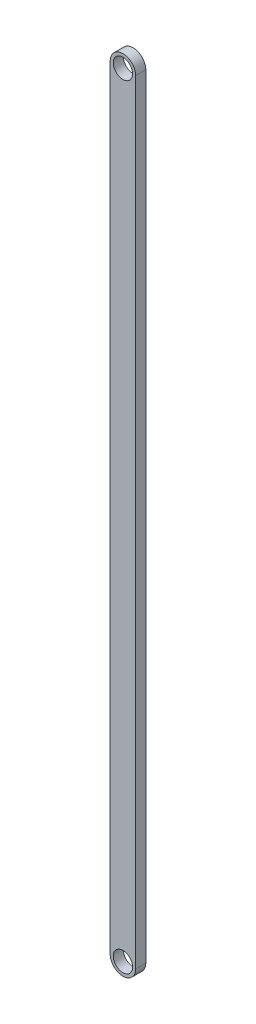
ISO-10303-21;
HEADER;
FILE_DESCRIPTION(('STEP AP214'),'2;1');
FILE_NAME('part.step','',(''),(''),'','','');
FILE_SCHEMA(('AUTOMOTIVE_DESIGN { 1 0 10303 214 1 1 1 1 }'));
ENDSEC;
DATA;
#1=APPLICATION_CONTEXT('core data for automotive mechanical design processes');
#2=APPLICATION_PROTOCOL_DEFINITION('international standard','automotive_design',2000,#1);
#3=PRODUCT_CONTEXT('',#1,'mechanical');
#4=PRODUCT('Part','Part','',(#3));
#5=PRODUCT_RELATED_PRODUCT_CATEGORY('part','',(#4));
#6=PRODUCT_DEFINITION_FORMATION('','',#4);
#7=PRODUCT_DEFINITION_CONTEXT('part definition',#1,'design');
#8=PRODUCT_DEFINITION('design','',#6,#7);
#9=PRODUCT_DEFINITION_SHAPE('','',#8);
#10=(LENGTH_UNIT() NAMED_UNIT(*) SI_UNIT(.MILLI.,.METRE.));
#11=(NAMED_UNIT(*) PLANE_ANGLE_UNIT() SI_UNIT($,.RADIAN.));
#12=(NAMED_UNIT(*) SI_UNIT($,.STERADIAN.) SOLID_ANGLE_UNIT());
#13=UNCERTAINTY_MEASURE_WITH_UNIT(LENGTH_MEASURE(1.E-05),#10,'distance_accuracy_value','');
#14=(GEOMETRIC_REPRESENTATION_CONTEXT(3) GLOBAL_UNCERTAINTY_ASSIGNED_CONTEXT((#13)) GLOBAL_UNIT_ASSIGNED_CONTEXT((#10,
#11,#12)) REPRESENTATION_CONTEXT('',''));
#15=CARTESIAN_POINT('',(0.,0.,0.));
#16=DIRECTION('',(0.,0.,1.));
#17=DIRECTION('',(1.,0.,0.));
#18=AXIS2_PLACEMENT_3D('',#15,#16,#17);
#19=CARTESIAN_POINT('',(-4.826,19.1971557150372,5.08));
#20=DIRECTION('',(1.,0.,0.));
#21=DIRECTION('',(0.,1.,0.));
#22=AXIS2_PLACEMENT_3D('',#19,#20,#21);
#23=PLANE('',#22);
#24=DIRECTION('',(0.,-1.,0.));
#25=VECTOR('',#24,1.);
#26=CARTESIAN_POINT('',(-4.826,19.1971557150372,0.));
#27=LINE('',#26,#25);
#28=CARTESIAN_POINT('',(-4.826,19.1971557150372,0.));
#29=VERTEX_POINT('',#28);
#30=CARTESIAN_POINT('',(-4.82599999999995,-366.882844284963,0.));
#31=VERTEX_POINT('',#30);
#32=EDGE_CURVE('E95',#29,#31,#27,.T.);
#33=ORIENTED_EDGE('',*,*,#32,.T.);
#34=DIRECTION('',(0.,0.,-1.));
#35=VECTOR('',#34,1.);
#36=CARTESIAN_POINT('',(-4.82599999999995,-366.882844284963,5.08));
#37=LINE('',#36,#35);
#38=CARTESIAN_POINT('',(-4.82599999999995,-366.882844284963,5.08));
#39=VERTEX_POINT('',#38);
#40=EDGE_CURVE('E11',#39,#31,#37,.T.);
#41=ORIENTED_EDGE('',*,*,#40,.F.);
#42=DIRECTION('',(0.,-1.,0.));
#43=VECTOR('',#42,1.);
#44=CARTESIAN_POINT('',(-4.826,19.1971557150372,5.08));
#45=LINE('',#44,#43);
#46=CARTESIAN_POINT('',(-4.826,19.1971557150372,5.08));
#47=VERTEX_POINT('',#46);
#48=EDGE_CURVE('E80',#47,#39,#45,.T.);
#49=ORIENTED_EDGE('',*,*,#48,.F.);
#50=DIRECTION('',(0.,0.,-1.));
#51=VECTOR('',#50,1.);
#52=CARTESIAN_POINT('',(-4.826,19.1971557150372,5.08));
#53=LINE('',#52,#51);
#54=EDGE_CURVE('E91',#47,#29,#53,.T.);
#55=ORIENTED_EDGE('',*,*,#54,.T.);
#56=EDGE_LOOP('',(#33,#41,#49,#55));
#57=FACE_BOUND('',#56,.T.);
#58=ADVANCED_FACE('F33',(#57),#23,.F.);
#59=CARTESIAN_POINT('',(1.52400000000005,-366.882844284963,5.08));
#60=DIRECTION('',(0.,0.,-1.));
#61=DIRECTION('',(-1.,0.,0.));
#62=AXIS2_PLACEMENT_3D('',#59,#60,#61);
#63=CYLINDRICAL_SURFACE('',#62,6.35);
#64=CARTESIAN_POINT('',(1.52400000000005,-366.882844284963,0.));
#65=DIRECTION('',(0.,0.,1.));
#66=DIRECTION('',(1.,0.,0.));
#67=AXIS2_PLACEMENT_3D('',#64,#65,#66);
#68=CIRCLE('',#67,6.35);
#69=CARTESIAN_POINT('',(7.87400000000005,-366.882844284963,0.));
#70=VERTEX_POINT('',#69);
#71=EDGE_CURVE('E85',#31,#70,#68,.T.);
#72=ORIENTED_EDGE('',*,*,#71,.T.);
#73=DIRECTION('',(0.,0.,-1.));
#74=VECTOR('',#73,1.);
#75=CARTESIAN_POINT('',(7.87400000000005,-366.882844284963,5.08));
#76=LINE('',#75,#74);
#77=CARTESIAN_POINT('',(7.87400000000005,-366.882844284963,5.08));
#78=VERTEX_POINT('',#77);
#79=EDGE_CURVE('E41',#78,#70,#76,.T.);
#80=ORIENTED_EDGE('',*,*,#79,.F.);
#81=CARTESIAN_POINT('',(1.52400000000005,-366.882844284963,5.08));
#82=DIRECTION('',(0.,0.,1.));
#83=DIRECTION('',(1.,0.,0.));
#84=AXIS2_PLACEMENT_3D('',#81,#82,#83);
#85=CIRCLE('',#84,6.35);
#86=EDGE_CURVE('E75',#39,#78,#85,.T.);
#87=ORIENTED_EDGE('',*,*,#86,.F.);
#88=ORIENTED_EDGE('',*,*,#40,.T.);
#89=EDGE_LOOP('',(#72,#80,#87,#88));
#90=FACE_BOUND('',#89,.T.);
#91=ADVANCED_FACE('F84',(#90),#63,.T.);
#92=CARTESIAN_POINT('',(7.874,19.1971557150372,5.08));
#93=DIRECTION('',(1.,0.,0.));
#94=DIRECTION('',(0.,1.,0.));
#95=AXIS2_PLACEMENT_3D('',#92,#93,#94);
#96=PLANE('',#95);
#97=DIRECTION('',(0.,-1.,0.));
#98=VECTOR('',#97,1.);
#99=CARTESIAN_POINT('',(7.874,19.1971557150372,0.));
#100=LINE('',#99,#98);
#101=CARTESIAN_POINT('',(7.874,19.1971557150372,0.));
#102=VERTEX_POINT('',#101);
#103=EDGE_CURVE('E100',#102,#70,#100,.T.);
#104=ORIENTED_EDGE('',*,*,#103,.F.);
#105=DIRECTION('',(0.,0.,-1.));
#106=VECTOR('',#105,1.);
#107=CARTESIAN_POINT('',(7.874,19.1971557150372,5.08));
#108=LINE('',#107,#106);
#109=CARTESIAN_POINT('',(7.874,19.1971557150372,5.08));
#110=VERTEX_POINT('',#109);
#111=EDGE_CURVE('E65',#110,#102,#108,.T.);
#112=ORIENTED_EDGE('',*,*,#111,.F.);
#113=DIRECTION('',(0.,-1.,0.));
#114=VECTOR('',#113,1.);
#115=CARTESIAN_POINT('',(7.874,19.1971557150372,5.08));
#116=LINE('',#115,#114);
#117=EDGE_CURVE('E78',#110,#78,#116,.T.);
#118=ORIENTED_EDGE('',*,*,#117,.T.);
#119=ORIENTED_EDGE('',*,*,#79,.T.);
#120=EDGE_LOOP('',(#104,#112,#118,#119));
#121=FACE_BOUND('',#120,.T.);
#122=ADVANCED_FACE('F89',(#121),#96,.T.);
#123=CARTESIAN_POINT('',(1.524,19.1971557150372,5.08));
#124=DIRECTION('',(0.,0.,-1.));
#125=DIRECTION('',(-1.,0.,0.));
#126=AXIS2_PLACEMENT_3D('',#123,#124,#125);
#127=CYLINDRICAL_SURFACE('',#126,6.35);
#128=CARTESIAN_POINT('',(1.524,19.1971557150372,0.));
#129=DIRECTION('',(0.,0.,1.));
#130=DIRECTION('',(1.,0.,0.));
#131=AXIS2_PLACEMENT_3D('',#128,#129,#130);
#132=CIRCLE('',#131,6.35);
#133=EDGE_CURVE('E68',#102,#29,#132,.T.);
#134=ORIENTED_EDGE('',*,*,#133,.T.);
#135=ORIENTED_EDGE('',*,*,#54,.F.);
#136=CARTESIAN_POINT('',(1.524,19.1971557150372,5.08));
#137=DIRECTION('',(0.,0.,1.));
#138=DIRECTION('',(1.,0.,0.));
#139=AXIS2_PLACEMENT_3D('',#136,#137,#138);
#140=CIRCLE('',#139,6.35);
#141=EDGE_CURVE('E49',#110,#47,#140,.T.);
#142=ORIENTED_EDGE('',*,*,#141,.F.);
#143=ORIENTED_EDGE('',*,*,#111,.T.);
#144=EDGE_LOOP('',(#134,#135,#142,#143));
#145=FACE_BOUND('',#144,.T.);
#146=ADVANCED_FACE('F119',(#145),#127,.T.);
#147=CARTESIAN_POINT('',(1.52400000000005,-366.882844284963,5.08));
#148=DIRECTION('',(0.,0.,1.));
#149=DIRECTION('',(1.,0.,0.));
#150=AXIS2_PLACEMENT_3D('',#147,#148,#149);
#151=PLANE('',#150);
#152=CARTESIAN_POINT('',(1.524,19.1971557150372,5.08));
#153=DIRECTION('',(0.,0.,1.));
#154=DIRECTION('',(1.,0.,0.));
#155=AXIS2_PLACEMENT_3D('',#152,#153,#154);
#156=CIRCLE('',#155,4.826);
#157=CARTESIAN_POINT('',(6.35,19.1971557150372,5.08));
#158=VERTEX_POINT('',#157);
#159=EDGE_CURVE('E169',#158,#158,#156,.T.);
#160=ORIENTED_EDGE('',*,*,#159,.F.);
#161=EDGE_LOOP('',(#160));
#162=FACE_BOUND('',#161,.T.);
#163=CARTESIAN_POINT('',(1.52400000000005,-366.882844284963,5.08));
#164=DIRECTION('',(0.,0.,1.));
#165=DIRECTION('',(1.,0.,0.));
#166=AXIS2_PLACEMENT_3D('',#163,#164,#165);
#167=CIRCLE('',#166,4.82600000000001);
#168=CARTESIAN_POINT('',(6.35000000000006,-366.882844284963,5.08));
#169=VERTEX_POINT('',#168);
#170=EDGE_CURVE('E174',#169,#169,#167,.T.);
#171=ORIENTED_EDGE('',*,*,#170,.F.);
#172=EDGE_LOOP('',(#171));
#173=FACE_BOUND('',#172,.T.);
#174=ORIENTED_EDGE('',*,*,#48,.T.);
#175=ORIENTED_EDGE('',*,*,#86,.T.);
#176=ORIENTED_EDGE('',*,*,#117,.F.);
#177=ORIENTED_EDGE('',*,*,#141,.T.);
#178=EDGE_LOOP('',(#174,#175,#176,#177));
#179=FACE_BOUND('',#178,.T.);
#180=ADVANCED_FACE('F76',(#162,#173,#179),#151,.T.);
#181=CARTESIAN_POINT('',(1.52400000000005,-366.882844284963,0.));
#182=DIRECTION('',(0.,0.,1.));
#183=DIRECTION('',(1.,0.,0.));
#184=AXIS2_PLACEMENT_3D('',#181,#182,#183);
#185=PLANE('',#184);
#186=CARTESIAN_POINT('',(1.524,19.1971557150372,0.));
#187=DIRECTION('',(0.,0.,1.));
#188=DIRECTION('',(1.,0.,0.));
#189=AXIS2_PLACEMENT_3D('',#186,#187,#188);
#190=CIRCLE('',#189,4.826);
#191=CARTESIAN_POINT('',(6.35,19.1971557150372,0.));
#192=VERTEX_POINT('',#191);
#193=EDGE_CURVE('E98',#192,#192,#190,.T.);
#194=ORIENTED_EDGE('',*,*,#193,.T.);
#195=EDGE_LOOP('',(#194));
#196=FACE_BOUND('',#195,.T.);
#197=CARTESIAN_POINT('',(1.52400000000005,-366.882844284963,0.));
#198=DIRECTION('',(0.,0.,1.));
#199=DIRECTION('',(1.,0.,0.));
#200=AXIS2_PLACEMENT_3D('',#197,#198,#199);
#201=CIRCLE('',#200,4.82600000000001);
#202=CARTESIAN_POINT('',(6.35000000000006,-366.882844284963,0.));
#203=VERTEX_POINT('',#202);
#204=EDGE_CURVE('E170',#203,#203,#201,.T.);
#205=ORIENTED_EDGE('',*,*,#204,.T.);
#206=EDGE_LOOP('',(#205));
#207=FACE_BOUND('',#206,.T.);
#208=ORIENTED_EDGE('',*,*,#32,.F.);
#209=ORIENTED_EDGE('',*,*,#133,.F.);
#210=ORIENTED_EDGE('',*,*,#103,.T.);
#211=ORIENTED_EDGE('',*,*,#71,.F.);
#212=EDGE_LOOP('',(#208,#209,#210,#211));
#213=FACE_BOUND('',#212,.T.);
#214=ADVANCED_FACE('F107',(#196,#207,#213),#185,.F.);
#215=CARTESIAN_POINT('',(1.52400000000005,-366.882844284963,0.));
#216=DIRECTION('',(0.,0.,1.));
#217=DIRECTION('',(1.,0.,0.));
#218=AXIS2_PLACEMENT_3D('',#215,#216,#217);
#219=CYLINDRICAL_SURFACE('',#218,4.82600000000001);
#220=ORIENTED_EDGE('',*,*,#204,.F.);
#221=EDGE_LOOP('',(#220));
#222=FACE_BOUND('',#221,.T.);
#223=ORIENTED_EDGE('',*,*,#170,.T.);
#224=EDGE_LOOP('',(#223));
#225=FACE_BOUND('',#224,.T.);
#226=ADVANCED_FACE('F109',(#222,#225),#219,.F.);
#227=CARTESIAN_POINT('',(1.524,19.1971557150372,0.));
#228=DIRECTION('',(0.,0.,1.));
#229=DIRECTION('',(1.,0.,0.));
#230=AXIS2_PLACEMENT_3D('',#227,#228,#229);
#231=CYLINDRICAL_SURFACE('',#230,4.826);
#232=ORIENTED_EDGE('',*,*,#193,.F.);
#233=EDGE_LOOP('',(#232));
#234=FACE_BOUND('',#233,.T.);
#235=ORIENTED_EDGE('',*,*,#159,.T.);
#236=EDGE_LOOP('',(#235));
#237=FACE_BOUND('',#236,.T.);
#238=ADVANCED_FACE('F116',(#234,#237),#231,.F.);
#239=CLOSED_SHELL('',(#58,#91,#122,#146,#180,#214,#226,#238));
#240=MANIFOLD_SOLID_BREP('B2',#239);
#241=ADVANCED_BREP_SHAPE_REPRESENTATION('',(#18,#240),#14);
#242=SHAPE_DEFINITION_REPRESENTATION(#9,#241);
ENDSEC;
END-ISO-10303-21;
